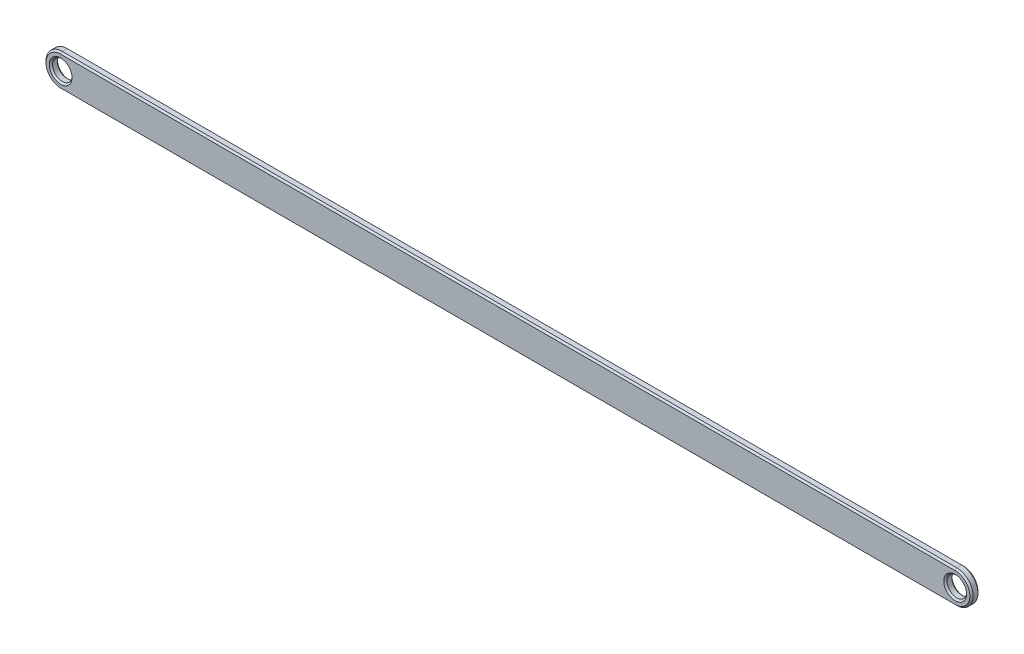
ISO-10303-21;
HEADER;
FILE_DESCRIPTION(('STEP AP214'),'2;1');
FILE_NAME('part.step','',(''),(''),'','','');
FILE_SCHEMA(('AUTOMOTIVE_DESIGN { 1 0 10303 214 1 1 1 1 }'));
ENDSEC;
DATA;
#1=APPLICATION_CONTEXT('core data for automotive mechanical design processes');
#2=APPLICATION_PROTOCOL_DEFINITION('international standard','automotive_design',2000,#1);
#3=PRODUCT_CONTEXT('',#1,'mechanical');
#4=PRODUCT('Part','Part','',(#3));
#5=PRODUCT_RELATED_PRODUCT_CATEGORY('part','',(#4));
#6=PRODUCT_DEFINITION_FORMATION('','',#4);
#7=PRODUCT_DEFINITION_CONTEXT('part definition',#1,'design');
#8=PRODUCT_DEFINITION('design','',#6,#7);
#9=PRODUCT_DEFINITION_SHAPE('','',#8);
#10=(LENGTH_UNIT() NAMED_UNIT(*) SI_UNIT(.MILLI.,.METRE.));
#11=(NAMED_UNIT(*) PLANE_ANGLE_UNIT() SI_UNIT($,.RADIAN.));
#12=(NAMED_UNIT(*) SI_UNIT($,.STERADIAN.) SOLID_ANGLE_UNIT());
#13=UNCERTAINTY_MEASURE_WITH_UNIT(LENGTH_MEASURE(1.E-05),#10,'distance_accuracy_value','');
#14=(GEOMETRIC_REPRESENTATION_CONTEXT(3) GLOBAL_UNCERTAINTY_ASSIGNED_CONTEXT((#13)) GLOBAL_UNIT_ASSIGNED_CONTEXT((#10,
#11,#12)) REPRESENTATION_CONTEXT('',''));
#15=CARTESIAN_POINT('',(0.,0.,0.));
#16=DIRECTION('',(0.,0.,1.));
#17=DIRECTION('',(1.,0.,0.));
#18=AXIS2_PLACEMENT_3D('',#15,#16,#17);
#19=CARTESIAN_POINT('',(-1372.5,0.,25.));
#20=DIRECTION('',(0.,0.,1.));
#21=DIRECTION('',(1.,0.,0.));
#22=AXIS2_PLACEMENT_3D('',#19,#20,#21);
#23=PLANE('',#22);
#24=CARTESIAN_POINT('',(1372.5,3.36165546365948E-13,25.));
#25=DIRECTION('',(0.,0.,1.));
#26=DIRECTION('',(1.,0.,0.));
#27=AXIS2_PLACEMENT_3D('',#24,#25,#26);
#28=CIRCLE('',#27,35.0000000000001);
#29=CARTESIAN_POINT('',(1407.5,3.36165546365948E-13,25.));
#30=VERTEX_POINT('',#29);
#31=EDGE_CURVE('E11',#30,#30,#28,.F.);
#32=ORIENTED_EDGE('',*,*,#31,.T.);
#33=EDGE_LOOP('',(#32));
#34=FACE_BOUND('',#33,.T.);
#35=CARTESIAN_POINT('',(1372.5,3.36165546365948E-13,25.));
#36=DIRECTION('',(0.,0.,1.));
#37=DIRECTION('',(1.,0.,0.));
#38=AXIS2_PLACEMENT_3D('',#35,#36,#37);
#39=CIRCLE('',#38,45.0000000000008);
#40=CARTESIAN_POINT('',(1372.5,-45.0000000000004,25.));
#41=VERTEX_POINT('',#40);
#42=CARTESIAN_POINT('',(1372.5,45.0000000000011,25.));
#43=VERTEX_POINT('',#42);
#44=EDGE_CURVE('E50',#41,#43,#39,.T.);
#45=ORIENTED_EDGE('',*,*,#44,.T.);
#46=DIRECTION('',(-1.,0.,0.));
#47=VECTOR('',#46,1.);
#48=CARTESIAN_POINT('',(-1372.5,45.0000000000008,25.));
#49=LINE('',#48,#47);
#50=CARTESIAN_POINT('',(-1372.5,45.0000000000008,25.));
#51=VERTEX_POINT('',#50);
#52=EDGE_CURVE('E42',#43,#51,#49,.T.);
#53=ORIENTED_EDGE('',*,*,#52,.T.);
#54=CARTESIAN_POINT('',(-1372.5,0.,25.));
#55=DIRECTION('',(0.,0.,1.));
#56=DIRECTION('',(1.,0.,0.));
#57=AXIS2_PLACEMENT_3D('',#54,#55,#56);
#58=CIRCLE('',#57,45.0000000000008);
#59=CARTESIAN_POINT('',(-1372.5,-45.0000000000008,25.));
#60=VERTEX_POINT('',#59);
#61=EDGE_CURVE('E168',#51,#60,#58,.T.);
#62=ORIENTED_EDGE('',*,*,#61,.T.);
#63=DIRECTION('',(1.,0.,0.));
#64=VECTOR('',#63,1.);
#65=CARTESIAN_POINT('',(1372.5,-45.0000000000004,25.));
#66=LINE('',#65,#64);
#67=EDGE_CURVE('E55',#60,#41,#66,.T.);
#68=ORIENTED_EDGE('',*,*,#67,.T.);
#69=EDGE_LOOP('',(#45,#53,#62,#68));
#70=FACE_BOUND('',#69,.T.);
#71=CARTESIAN_POINT('',(-1372.5,0.,25.));
#72=DIRECTION('',(0.,0.,1.));
#73=DIRECTION('',(1.,0.,0.));
#74=AXIS2_PLACEMENT_3D('',#71,#72,#73);
#75=CIRCLE('',#74,35.0000000000001);
#76=CARTESIAN_POINT('',(-1337.5,0.,25.));
#77=VERTEX_POINT('',#76);
#78=EDGE_CURVE('E165',#77,#77,#75,.F.);
#79=ORIENTED_EDGE('',*,*,#78,.T.);
#80=EDGE_LOOP('',(#79));
#81=FACE_BOUND('',#80,.T.);
#82=ADVANCED_FACE('F33',(#34,#70,#81),#23,.T.);
#83=CARTESIAN_POINT('',(-1372.5,0.,0.));
#84=DIRECTION('',(0.,0.,1.));
#85=DIRECTION('',(1.,0.,0.));
#86=AXIS2_PLACEMENT_3D('',#83,#84,#85);
#87=PLANE('',#86);
#88=CARTESIAN_POINT('',(1372.5,3.36165546365948E-13,0.));
#89=DIRECTION('',(0.,0.,1.));
#90=DIRECTION('',(1.,0.,0.));
#91=AXIS2_PLACEMENT_3D('',#88,#89,#90);
#92=CIRCLE('',#91,35.0000000000001);
#93=CARTESIAN_POINT('',(1407.5,3.36165546365948E-13,0.));
#94=VERTEX_POINT('',#93);
#95=EDGE_CURVE('E130',#94,#94,#92,.T.);
#96=ORIENTED_EDGE('',*,*,#95,.T.);
#97=EDGE_LOOP('',(#96));
#98=FACE_BOUND('',#97,.T.);
#99=CARTESIAN_POINT('',(-1372.5,0.,0.));
#100=DIRECTION('',(0.,0.,1.));
#101=DIRECTION('',(1.,0.,0.));
#102=AXIS2_PLACEMENT_3D('',#99,#100,#101);
#103=CIRCLE('',#102,35.0000000000001);
#104=CARTESIAN_POINT('',(-1337.5,0.,0.));
#105=VERTEX_POINT('',#104);
#106=EDGE_CURVE('E127',#105,#105,#103,.T.);
#107=ORIENTED_EDGE('',*,*,#106,.T.);
#108=EDGE_LOOP('',(#107));
#109=FACE_BOUND('',#108,.T.);
#110=CARTESIAN_POINT('',(1372.5,3.36165546365948E-13,0.));
#111=DIRECTION('',(0.,0.,1.));
#112=DIRECTION('',(1.,0.,0.));
#113=AXIS2_PLACEMENT_3D('',#110,#111,#112);
#114=CIRCLE('',#113,44.9999999999994);
#115=CARTESIAN_POINT('',(1372.5,44.9999999999998,0.));
#116=VERTEX_POINT('',#115);
#117=CARTESIAN_POINT('',(1372.5,-44.9999999999991,0.));
#118=VERTEX_POINT('',#117);
#119=EDGE_CURVE('E126',#116,#118,#114,.F.);
#120=ORIENTED_EDGE('',*,*,#119,.T.);
#121=DIRECTION('',(-1.,0.,0.));
#122=VECTOR('',#121,1.);
#123=CARTESIAN_POINT('',(-1372.5,-44.9999999999995,0.));
#124=LINE('',#123,#122);
#125=CARTESIAN_POINT('',(-1372.5,-44.9999999999994,0.));
#126=VERTEX_POINT('',#125);
#127=EDGE_CURVE('E105',#118,#126,#124,.T.);
#128=ORIENTED_EDGE('',*,*,#127,.T.);
#129=CARTESIAN_POINT('',(-1372.5,0.,0.));
#130=DIRECTION('',(0.,0.,1.));
#131=DIRECTION('',(1.,0.,0.));
#132=AXIS2_PLACEMENT_3D('',#129,#130,#131);
#133=CIRCLE('',#132,44.9999999999994);
#134=CARTESIAN_POINT('',(-1372.5,44.9999999999994,0.));
#135=VERTEX_POINT('',#134);
#136=EDGE_CURVE('E115',#126,#135,#133,.F.);
#137=ORIENTED_EDGE('',*,*,#136,.T.);
#138=DIRECTION('',(1.,0.,0.));
#139=VECTOR('',#138,1.);
#140=CARTESIAN_POINT('',(-1372.5,44.9999999999994,0.));
#141=LINE('',#140,#139);
#142=EDGE_CURVE('E121',#135,#116,#141,.T.);
#143=ORIENTED_EDGE('',*,*,#142,.T.);
#144=EDGE_LOOP('',(#120,#128,#137,#143));
#145=FACE_BOUND('',#144,.T.);
#146=ADVANCED_FACE('F124',(#98,#109,#145),#87,.F.);
#147=CARTESIAN_POINT('',(-1372.5,0.,25.));
#148=DIRECTION('',(0.,0.,-1.));
#149=DIRECTION('',(-1.,0.,0.));
#150=AXIS2_PLACEMENT_3D('',#147,#148,#149);
#151=CYLINDRICAL_SURFACE('',#150,50.);
#152=DIRECTION('',(0.,0.,-1.));
#153=VECTOR('',#152,1.);
#154=CARTESIAN_POINT('',(-1372.5,50.,25.));
#155=LINE('',#154,#153);
#156=CARTESIAN_POINT('',(-1372.5,50.,20.000000000001));
#157=VERTEX_POINT('',#156);
#158=CARTESIAN_POINT('',(-1372.5,50.,5.00000000000057));
#159=VERTEX_POINT('',#158);
#160=EDGE_CURVE('E177',#157,#159,#155,.T.);
#161=ORIENTED_EDGE('',*,*,#160,.T.);
#162=CARTESIAN_POINT('',(-1372.5,0.,5.00000000000057));
#163=DIRECTION('',(0.,0.,1.));
#164=DIRECTION('',(1.,0.,0.));
#165=AXIS2_PLACEMENT_3D('',#162,#163,#164);
#166=CIRCLE('',#165,50.);
#167=CARTESIAN_POINT('',(-1372.5,-50.,5.00000000000057));
#168=VERTEX_POINT('',#167);
#169=EDGE_CURVE('E163',#159,#168,#166,.T.);
#170=ORIENTED_EDGE('',*,*,#169,.T.);
#171=DIRECTION('',(0.,0.,-1.));
#172=VECTOR('',#171,1.);
#173=CARTESIAN_POINT('',(-1372.5,-50.,25.));
#174=LINE('',#173,#172);
#175=CARTESIAN_POINT('',(-1372.5,-50.,20.000000000001));
#176=VERTEX_POINT('',#175);
#177=EDGE_CURVE('E122',#176,#168,#174,.T.);
#178=ORIENTED_EDGE('',*,*,#177,.F.);
#179=CARTESIAN_POINT('',(-1372.5,0.,20.000000000001));
#180=DIRECTION('',(0.,0.,1.));
#181=DIRECTION('',(1.,0.,0.));
#182=AXIS2_PLACEMENT_3D('',#179,#180,#181);
#183=CIRCLE('',#182,50.);
#184=EDGE_CURVE('E161',#176,#157,#183,.F.);
#185=ORIENTED_EDGE('',*,*,#184,.T.);
#186=EDGE_LOOP('',(#161,#170,#178,#185));
#187=FACE_BOUND('',#186,.T.);
#188=ADVANCED_FACE('F203',(#187),#151,.T.);
#189=CARTESIAN_POINT('',(1372.5,-49.9999999999997,25.));
#190=DIRECTION('',(0.,1.,0.));
#191=DIRECTION('',(-1.,0.,0.));
#192=AXIS2_PLACEMENT_3D('',#189,#190,#191);
#193=PLANE('',#192);
#194=ORIENTED_EDGE('',*,*,#177,.T.);
#195=DIRECTION('',(1.,0.,0.));
#196=VECTOR('',#195,1.);
#197=CARTESIAN_POINT('',(1372.5,-49.9999999999997,5.00000000000057));
#198=LINE('',#197,#196);
#199=CARTESIAN_POINT('',(1372.5,-49.9999999999997,5.00000000000057));
#200=VERTEX_POINT('',#199);
#201=EDGE_CURVE('E108',#168,#200,#198,.T.);
#202=ORIENTED_EDGE('',*,*,#201,.T.);
#203=DIRECTION('',(0.,0.,-1.));
#204=VECTOR('',#203,1.);
#205=CARTESIAN_POINT('',(1372.5,-49.9999999999997,25.));
#206=LINE('',#205,#204);
#207=CARTESIAN_POINT('',(1372.5,-49.9999999999997,20.000000000001));
#208=VERTEX_POINT('',#207);
#209=EDGE_CURVE('E200',#208,#200,#206,.T.);
#210=ORIENTED_EDGE('',*,*,#209,.F.);
#211=DIRECTION('',(-1.,0.,0.));
#212=VECTOR('',#211,1.);
#213=CARTESIAN_POINT('',(-1372.5,-50.,20.000000000001));
#214=LINE('',#213,#212);
#215=EDGE_CURVE('E149',#208,#176,#214,.T.);
#216=ORIENTED_EDGE('',*,*,#215,.T.);
#217=EDGE_LOOP('',(#194,#202,#210,#216));
#218=FACE_BOUND('',#217,.T.);
#219=ADVANCED_FACE('F198',(#218),#193,.F.);
#220=CARTESIAN_POINT('',(1372.5,3.36165546365948E-13,25.));
#221=DIRECTION('',(0.,0.,-1.));
#222=DIRECTION('',(-1.,0.,0.));
#223=AXIS2_PLACEMENT_3D('',#220,#221,#222);
#224=CYLINDRICAL_SURFACE('',#223,50.);
#225=ORIENTED_EDGE('',*,*,#209,.T.);
#226=CARTESIAN_POINT('',(1372.5,3.36165546365948E-13,5.00000000000057));
#227=DIRECTION('',(0.,0.,1.));
#228=DIRECTION('',(1.,0.,0.));
#229=AXIS2_PLACEMENT_3D('',#226,#227,#228);
#230=CIRCLE('',#229,50.);
#231=CARTESIAN_POINT('',(1372.5,50.0000000000003,5.00000000000057));
#232=VERTEX_POINT('',#231);
#233=EDGE_CURVE('E154',#200,#232,#230,.T.);
#234=ORIENTED_EDGE('',*,*,#233,.T.);
#235=DIRECTION('',(0.,0.,-1.));
#236=VECTOR('',#235,1.);
#237=CARTESIAN_POINT('',(1372.5,50.0000000000003,25.));
#238=LINE('',#237,#236);
#239=CARTESIAN_POINT('',(1372.5,50.0000000000003,20.000000000001));
#240=VERTEX_POINT('',#239);
#241=EDGE_CURVE('E206',#240,#232,#238,.T.);
#242=ORIENTED_EDGE('',*,*,#241,.F.);
#243=CARTESIAN_POINT('',(1372.5,3.36165546365948E-13,20.000000000001));
#244=DIRECTION('',(0.,0.,1.));
#245=DIRECTION('',(1.,0.,0.));
#246=AXIS2_PLACEMENT_3D('',#243,#244,#245);
#247=CIRCLE('',#246,50.);
#248=EDGE_CURVE('E152',#240,#208,#247,.F.);
#249=ORIENTED_EDGE('',*,*,#248,.T.);
#250=EDGE_LOOP('',(#225,#234,#242,#249));
#251=FACE_BOUND('',#250,.T.);
#252=ADVANCED_FACE('F219',(#251),#224,.T.);
#253=CARTESIAN_POINT('',(1372.5,50.0000000000003,25.));
#254=DIRECTION('',(0.,-1.,0.));
#255=DIRECTION('',(1.,0.,0.));
#256=AXIS2_PLACEMENT_3D('',#253,#254,#255);
#257=PLANE('',#256);
#258=ORIENTED_EDGE('',*,*,#241,.T.);
#259=DIRECTION('',(-1.,0.,0.));
#260=VECTOR('',#259,1.);
#261=CARTESIAN_POINT('',(1372.5,50.0000000000003,5.00000000000057));
#262=LINE('',#261,#260);
#263=EDGE_CURVE('E159',#232,#159,#262,.T.);
#264=ORIENTED_EDGE('',*,*,#263,.T.);
#265=ORIENTED_EDGE('',*,*,#160,.F.);
#266=DIRECTION('',(1.,0.,0.));
#267=VECTOR('',#266,1.);
#268=CARTESIAN_POINT('',(1372.5,50.0000000000003,20.000000000001));
#269=LINE('',#268,#267);
#270=EDGE_CURVE('E156',#157,#240,#269,.T.);
#271=ORIENTED_EDGE('',*,*,#270,.T.);
#272=EDGE_LOOP('',(#258,#264,#265,#271));
#273=FACE_BOUND('',#272,.T.);
#274=ADVANCED_FACE('F223',(#273),#257,.F.);
#275=CARTESIAN_POINT('',(-1372.5,0.,25.));
#276=DIRECTION('',(0.,0.,-1.));
#277=DIRECTION('',(-1.,0.,0.));
#278=AXIS2_PLACEMENT_3D('',#275,#276,#277);
#279=CYLINDRICAL_SURFACE('',#278,30.);
#280=CARTESIAN_POINT('',(-1372.5,0.,4.99999999999997));
#281=DIRECTION('',(0.,0.,1.));
#282=DIRECTION('',(1.,0.,0.));
#283=AXIS2_PLACEMENT_3D('',#280,#281,#282);
#284=CIRCLE('',#283,30.);
#285=CARTESIAN_POINT('',(-1342.5,0.,4.99999999999997));
#286=VERTEX_POINT('',#285);
#287=EDGE_CURVE('E146',#286,#286,#284,.F.);
#288=ORIENTED_EDGE('',*,*,#287,.T.);
#289=EDGE_LOOP('',(#288));
#290=FACE_BOUND('',#289,.T.);
#291=CARTESIAN_POINT('',(-1372.5,0.,19.9999999999998));
#292=DIRECTION('',(0.,0.,1.));
#293=DIRECTION('',(1.,0.,0.));
#294=AXIS2_PLACEMENT_3D('',#291,#292,#293);
#295=CIRCLE('',#294,30.);
#296=CARTESIAN_POINT('',(-1342.5,0.,19.9999999999998));
#297=VERTEX_POINT('',#296);
#298=EDGE_CURVE('E143',#297,#297,#295,.T.);
#299=ORIENTED_EDGE('',*,*,#298,.T.);
#300=EDGE_LOOP('',(#299));
#301=FACE_BOUND('',#300,.T.);
#302=ADVANCED_FACE('F239',(#290,#301),#279,.F.);
#303=CARTESIAN_POINT('',(1372.5,3.36165546365948E-13,25.));
#304=DIRECTION('',(0.,0.,-1.));
#305=DIRECTION('',(-1.,0.,0.));
#306=AXIS2_PLACEMENT_3D('',#303,#304,#305);
#307=CYLINDRICAL_SURFACE('',#306,30.);
#308=CARTESIAN_POINT('',(1372.5,3.36165546365948E-13,4.99999999999997));
#309=DIRECTION('',(0.,0.,1.));
#310=DIRECTION('',(1.,0.,0.));
#311=AXIS2_PLACEMENT_3D('',#308,#309,#310);
#312=CIRCLE('',#311,30.);
#313=CARTESIAN_POINT('',(1402.5,3.36165546365948E-13,4.99999999999997));
#314=VERTEX_POINT('',#313);
#315=EDGE_CURVE('E140',#314,#314,#312,.F.);
#316=ORIENTED_EDGE('',*,*,#315,.T.);
#317=EDGE_LOOP('',(#316));
#318=FACE_BOUND('',#317,.T.);
#319=CARTESIAN_POINT('',(1372.5,3.36165546365948E-13,19.9999999999998));
#320=DIRECTION('',(0.,0.,1.));
#321=DIRECTION('',(1.,0.,0.));
#322=AXIS2_PLACEMENT_3D('',#319,#320,#321);
#323=CIRCLE('',#322,30.);
#324=CARTESIAN_POINT('',(1402.5,3.36165546365948E-13,19.9999999999998));
#325=VERTEX_POINT('',#324);
#326=EDGE_CURVE('E137',#325,#325,#323,.T.);
#327=ORIENTED_EDGE('',*,*,#326,.T.);
#328=EDGE_LOOP('',(#327));
#329=FACE_BOUND('',#328,.T.);
#330=ADVANCED_FACE('F241',(#318,#329),#307,.F.);
#331=CARTESIAN_POINT('',(1372.5,3.36165546365948E-13,0.));
#332=DIRECTION('',(0.,0.,-1.));
#333=DIRECTION('',(-1.,0.,0.));
#334=AXIS2_PLACEMENT_3D('',#331,#332,#333);
#335=CONICAL_SURFACE('',#334,35.0000000000001,0.78539816339746);
#336=ORIENTED_EDGE('',*,*,#315,.F.);
#337=EDGE_LOOP('',(#336));
#338=FACE_BOUND('',#337,.T.);
#339=ORIENTED_EDGE('',*,*,#95,.F.);
#340=EDGE_LOOP('',(#339));
#341=FACE_BOUND('',#340,.T.);
#342=ADVANCED_FACE('F248',(#338,#341),#335,.F.);
#343=CARTESIAN_POINT('',(-1372.5,0.,0.));
#344=DIRECTION('',(0.,0.,-1.));
#345=DIRECTION('',(-1.,0.,0.));
#346=AXIS2_PLACEMENT_3D('',#343,#344,#345);
#347=CONICAL_SURFACE('',#346,35.0000000000001,0.78539816339746);
#348=ORIENTED_EDGE('',*,*,#287,.F.);
#349=EDGE_LOOP('',(#348));
#350=FACE_BOUND('',#349,.T.);
#351=ORIENTED_EDGE('',*,*,#106,.F.);
#352=EDGE_LOOP('',(#351));
#353=FACE_BOUND('',#352,.T.);
#354=ADVANCED_FACE('F264',(#350,#353),#347,.F.);
#355=CARTESIAN_POINT('',(1372.5,50.0000000000003,5.00000000000057));
#356=DIRECTION('',(0.,-0.707106781186548,0.707106781186547));
#357=DIRECTION('',(-1.,0.,0.));
#358=AXIS2_PLACEMENT_3D('',#355,#356,#357);
#359=PLANE('',#358);
#360=DIRECTION('',(0.,0.707106781186547,0.707106781186548));
#361=VECTOR('',#360,1.);
#362=CARTESIAN_POINT('',(1372.5,44.9999999999998,0.));
#363=LINE('',#362,#361);
#364=EDGE_CURVE('E111',#116,#232,#363,.T.);
#365=ORIENTED_EDGE('',*,*,#364,.F.);
#366=ORIENTED_EDGE('',*,*,#142,.F.);
#367=DIRECTION('',(0.,-0.707106781186547,-0.707106781186548));
#368=VECTOR('',#367,1.);
#369=CARTESIAN_POINT('',(-1372.5,50.,5.00000000000057));
#370=LINE('',#369,#368);
#371=EDGE_CURVE('E118',#159,#135,#370,.T.);
#372=ORIENTED_EDGE('',*,*,#371,.F.);
#373=ORIENTED_EDGE('',*,*,#263,.F.);
#374=EDGE_LOOP('',(#365,#366,#372,#373));
#375=FACE_BOUND('',#374,.T.);
#376=ADVANCED_FACE('F212',(#375),#359,.F.);
#377=CARTESIAN_POINT('',(-1372.5,0.,5.00000000000057));
#378=DIRECTION('',(0.,0.,1.));
#379=DIRECTION('',(1.,0.,0.));
#380=AXIS2_PLACEMENT_3D('',#377,#378,#379);
#381=CONICAL_SURFACE('',#380,50.,0.785398163397448);
#382=ORIENTED_EDGE('',*,*,#371,.T.);
#383=ORIENTED_EDGE('',*,*,#136,.F.);
#384=DIRECTION('',(0.,0.707106781186547,-0.707106781186548));
#385=VECTOR('',#384,1.);
#386=CARTESIAN_POINT('',(-1372.5,-50.,5.00000000000057));
#387=LINE('',#386,#385);
#388=EDGE_CURVE('E101',#168,#126,#387,.T.);
#389=ORIENTED_EDGE('',*,*,#388,.F.);
#390=ORIENTED_EDGE('',*,*,#169,.F.);
#391=EDGE_LOOP('',(#382,#383,#389,#390));
#392=FACE_BOUND('',#391,.T.);
#393=ADVANCED_FACE('F116',(#392),#381,.T.);
#394=CARTESIAN_POINT('',(1372.5,3.36165546365948E-13,5.00000000000057));
#395=DIRECTION('',(0.,0.,1.));
#396=DIRECTION('',(1.,0.,0.));
#397=AXIS2_PLACEMENT_3D('',#394,#395,#396);
#398=CONICAL_SURFACE('',#397,50.,0.785398163397448);
#399=ORIENTED_EDGE('',*,*,#364,.T.);
#400=ORIENTED_EDGE('',*,*,#233,.F.);
#401=DIRECTION('',(0.,-0.707106781186547,0.707106781186548));
#402=VECTOR('',#401,1.);
#403=CARTESIAN_POINT('',(1372.5,-44.9999999999991,0.));
#404=LINE('',#403,#402);
#405=EDGE_CURVE('E112',#118,#200,#404,.T.);
#406=ORIENTED_EDGE('',*,*,#405,.F.);
#407=ORIENTED_EDGE('',*,*,#119,.F.);
#408=EDGE_LOOP('',(#399,#400,#406,#407));
#409=FACE_BOUND('',#408,.T.);
#410=ADVANCED_FACE('F215',(#409),#398,.T.);
#411=CARTESIAN_POINT('',(1372.5,-49.9999999999997,5.00000000000057));
#412=DIRECTION('',(0.,0.707106781186548,0.707106781186547));
#413=DIRECTION('',(1.,0.,0.));
#414=AXIS2_PLACEMENT_3D('',#411,#412,#413);
#415=PLANE('',#414);
#416=ORIENTED_EDGE('',*,*,#388,.T.);
#417=ORIENTED_EDGE('',*,*,#127,.F.);
#418=ORIENTED_EDGE('',*,*,#405,.T.);
#419=ORIENTED_EDGE('',*,*,#201,.F.);
#420=EDGE_LOOP('',(#416,#417,#418,#419));
#421=FACE_BOUND('',#420,.T.);
#422=ADVANCED_FACE('F103',(#421),#415,.F.);
#423=CARTESIAN_POINT('',(1372.5,3.36165546365948E-13,19.9999999999998));
#424=DIRECTION('',(0.,0.,1.));
#425=DIRECTION('',(1.,0.,0.));
#426=AXIS2_PLACEMENT_3D('',#423,#424,#425);
#427=CONICAL_SURFACE('',#426,30.,0.785398163397438);
#428=ORIENTED_EDGE('',*,*,#31,.F.);
#429=EDGE_LOOP('',(#428));
#430=FACE_BOUND('',#429,.T.);
#431=ORIENTED_EDGE('',*,*,#326,.F.);
#432=EDGE_LOOP('',(#431));
#433=FACE_BOUND('',#432,.T.);
#434=ADVANCED_FACE('F271',(#430,#433),#427,.F.);
#435=CARTESIAN_POINT('',(-1372.5,-45.0000000000008,25.));
#436=DIRECTION('',(0.,-0.707106781186532,0.707106781186563));
#437=DIRECTION('',(-1.,0.,0.));
#438=AXIS2_PLACEMENT_3D('',#435,#436,#437);
#439=PLANE('',#438);
#440=DIRECTION('',(0.,0.707106781186563,0.707106781186532));
#441=VECTOR('',#440,1.);
#442=CARTESIAN_POINT('',(-1372.5,-50.,20.000000000001));
#443=LINE('',#442,#441);
#444=EDGE_CURVE('E181',#176,#60,#443,.T.);
#445=ORIENTED_EDGE('',*,*,#444,.F.);
#446=ORIENTED_EDGE('',*,*,#215,.F.);
#447=DIRECTION('',(0.,-0.707106781186563,-0.707106781186532));
#448=VECTOR('',#447,1.);
#449=CARTESIAN_POINT('',(1372.5,-45.0000000000004,25.));
#450=LINE('',#449,#448);
#451=EDGE_CURVE('E37',#41,#208,#450,.T.);
#452=ORIENTED_EDGE('',*,*,#451,.F.);
#453=ORIENTED_EDGE('',*,*,#67,.F.);
#454=EDGE_LOOP('',(#445,#446,#452,#453));
#455=FACE_BOUND('',#454,.T.);
#456=ADVANCED_FACE('F193',(#455),#439,.T.);
#457=CARTESIAN_POINT('',(1372.5,3.36165546365948E-13,25.));
#458=DIRECTION('',(0.,0.,-1.));
#459=DIRECTION('',(-1.,0.,0.));
#460=AXIS2_PLACEMENT_3D('',#457,#458,#459);
#461=CONICAL_SURFACE('',#460,45.0000000000008,0.78539816339747);
#462=ORIENTED_EDGE('',*,*,#451,.T.);
#463=ORIENTED_EDGE('',*,*,#248,.F.);
#464=DIRECTION('',(0.,0.707106781186563,-0.707106781186532));
#465=VECTOR('',#464,1.);
#466=CARTESIAN_POINT('',(1372.5,45.0000000000011,25.));
#467=LINE('',#466,#465);
#468=EDGE_CURVE('E180',#43,#240,#467,.T.);
#469=ORIENTED_EDGE('',*,*,#468,.F.);
#470=ORIENTED_EDGE('',*,*,#44,.F.);
#471=EDGE_LOOP('',(#462,#463,#469,#470));
#472=FACE_BOUND('',#471,.T.);
#473=ADVANCED_FACE('F190',(#472),#461,.T.);
#474=CARTESIAN_POINT('',(-1372.5,0.,25.));
#475=DIRECTION('',(0.,0.,-1.));
#476=DIRECTION('',(-1.,0.,0.));
#477=AXIS2_PLACEMENT_3D('',#474,#475,#476);
#478=CONICAL_SURFACE('',#477,45.0000000000008,0.78539816339747);
#479=ORIENTED_EDGE('',*,*,#444,.T.);
#480=ORIENTED_EDGE('',*,*,#61,.F.);
#481=DIRECTION('',(0.,-0.707106781186563,0.707106781186532));
#482=VECTOR('',#481,1.);
#483=CARTESIAN_POINT('',(-1372.5,50.,20.000000000001));
#484=LINE('',#483,#482);
#485=EDGE_CURVE('E178',#157,#51,#484,.T.);
#486=ORIENTED_EDGE('',*,*,#485,.F.);
#487=ORIENTED_EDGE('',*,*,#184,.F.);
#488=EDGE_LOOP('',(#479,#480,#486,#487));
#489=FACE_BOUND('',#488,.T.);
#490=ADVANCED_FACE('F228',(#489),#478,.T.);
#491=CARTESIAN_POINT('',(-1372.5,45.0000000000008,25.));
#492=DIRECTION('',(0.,0.707106781186532,0.707106781186563));
#493=DIRECTION('',(1.,0.,0.));
#494=AXIS2_PLACEMENT_3D('',#491,#492,#493);
#495=PLANE('',#494);
#496=ORIENTED_EDGE('',*,*,#468,.T.);
#497=ORIENTED_EDGE('',*,*,#270,.F.);
#498=ORIENTED_EDGE('',*,*,#485,.T.);
#499=ORIENTED_EDGE('',*,*,#52,.F.);
#500=EDGE_LOOP('',(#496,#497,#498,#499));
#501=FACE_BOUND('',#500,.T.);
#502=ADVANCED_FACE('F226',(#501),#495,.T.);
#503=CARTESIAN_POINT('',(-1372.5,0.,19.9999999999998));
#504=DIRECTION('',(0.,0.,1.));
#505=DIRECTION('',(1.,0.,0.));
#506=AXIS2_PLACEMENT_3D('',#503,#504,#505);
#507=CONICAL_SURFACE('',#506,30.,0.785398163397438);
#508=ORIENTED_EDGE('',*,*,#78,.F.);
#509=EDGE_LOOP('',(#508));
#510=FACE_BOUND('',#509,.T.);
#511=ORIENTED_EDGE('',*,*,#298,.F.);
#512=EDGE_LOOP('',(#511));
#513=FACE_BOUND('',#512,.T.);
#514=ADVANCED_FACE('F35',(#510,#513),#507,.F.);
#515=CLOSED_SHELL('',(#82,#146,#188,#219,#252,#274,#302,#330,#342,#354,#376,#393,#410,#422,#434,
#456,#473,#490,#502,#514));
#516=MANIFOLD_SOLID_BREP('B2',#515);
#517=ADVANCED_BREP_SHAPE_REPRESENTATION('',(#18,#516),#14);
#518=SHAPE_DEFINITION_REPRESENTATION(#9,#517);
ENDSEC;
END-ISO-10303-21;
